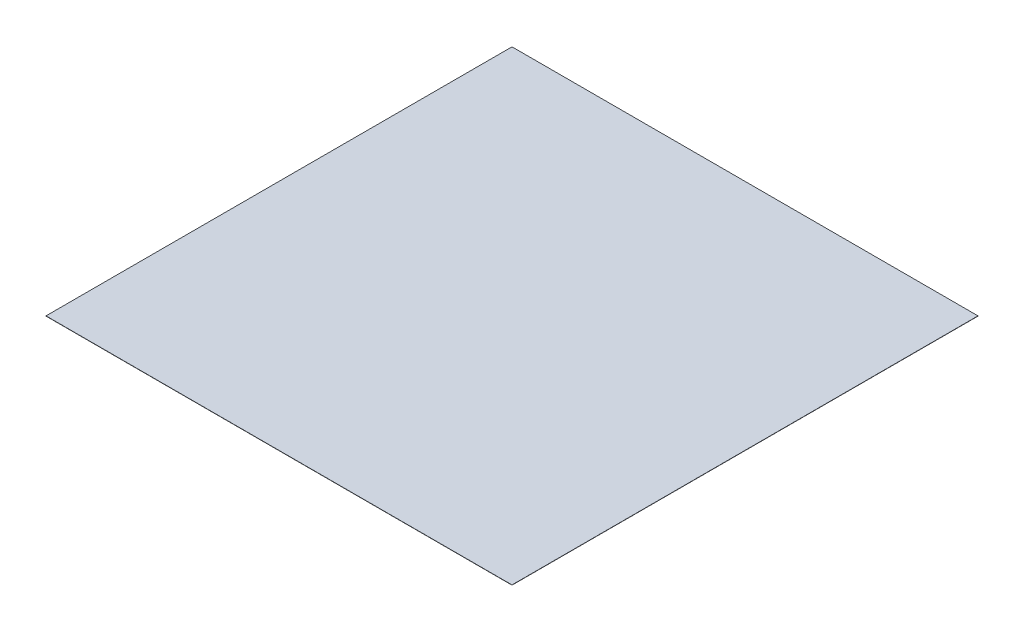
ISO-10303-21;
HEADER;
FILE_DESCRIPTION(('STEP AP214'),'2;1');
FILE_NAME('part.step','',(''),(''),'','','');
FILE_SCHEMA(('AUTOMOTIVE_DESIGN { 1 0 10303 214 1 1 1 1 }'));
ENDSEC;
DATA;
#1=APPLICATION_CONTEXT('core data for automotive mechanical design processes');
#2=APPLICATION_PROTOCOL_DEFINITION('international standard','automotive_design',2000,#1);
#3=PRODUCT_CONTEXT('',#1,'mechanical');
#4=PRODUCT('Part','Part','',(#3));
#5=PRODUCT_RELATED_PRODUCT_CATEGORY('part','',(#4));
#6=PRODUCT_DEFINITION_FORMATION('','',#4);
#7=PRODUCT_DEFINITION_CONTEXT('part definition',#1,'design');
#8=PRODUCT_DEFINITION('design','',#6,#7);
#9=PRODUCT_DEFINITION_SHAPE('','',#8);
#10=(LENGTH_UNIT() NAMED_UNIT(*) SI_UNIT(.MILLI.,.METRE.));
#11=(NAMED_UNIT(*) PLANE_ANGLE_UNIT() SI_UNIT($,.RADIAN.));
#12=(NAMED_UNIT(*) SI_UNIT($,.STERADIAN.) SOLID_ANGLE_UNIT());
#13=UNCERTAINTY_MEASURE_WITH_UNIT(LENGTH_MEASURE(1.E-05),#10,'distance_accuracy_value','');
#14=(GEOMETRIC_REPRESENTATION_CONTEXT(3) GLOBAL_UNCERTAINTY_ASSIGNED_CONTEXT((#13)) GLOBAL_UNIT_ASSIGNED_CONTEXT((#10,
#11,#12)) REPRESENTATION_CONTEXT('',''));
#15=CARTESIAN_POINT('',(0.,0.,0.));
#16=DIRECTION('',(0.,0.,1.));
#17=DIRECTION('',(1.,0.,0.));
#18=AXIS2_PLACEMENT_3D('',#15,#16,#17);
#19=CARTESIAN_POINT('',(5000.,5.,5000.));
#20=DIRECTION('',(-1.,0.,0.));
#21=DIRECTION('',(0.,0.,1.));
#22=AXIS2_PLACEMENT_3D('',#19,#20,#21);
#23=PLANE('',#22);
#24=DIRECTION('',(0.,0.,-1.));
#25=VECTOR('',#24,1.);
#26=CARTESIAN_POINT('',(5000.,0.,5000.));
#27=LINE('',#26,#25);
#28=CARTESIAN_POINT('',(5000.,0.,5000.));
#29=VERTEX_POINT('',#28);
#30=CARTESIAN_POINT('',(5000.,0.,-5000.));
#31=VERTEX_POINT('',#30);
#32=EDGE_CURVE('E111',#29,#31,#27,.T.);
#33=ORIENTED_EDGE('',*,*,#32,.T.);
#34=DIRECTION('',(0.,-1.,0.));
#35=VECTOR('',#34,1.);
#36=CARTESIAN_POINT('',(5000.,5.,-5000.));
#37=LINE('',#36,#35);
#38=CARTESIAN_POINT('',(5000.,5.,-5000.));
#39=VERTEX_POINT('',#38);
#40=EDGE_CURVE('E11',#39,#31,#37,.T.);
#41=ORIENTED_EDGE('',*,*,#40,.F.);
#42=DIRECTION('',(0.,0.,-1.));
#43=VECTOR('',#42,1.);
#44=CARTESIAN_POINT('',(5000.,5.,5000.));
#45=LINE('',#44,#43);
#46=CARTESIAN_POINT('',(5000.,5.,5000.));
#47=VERTEX_POINT('',#46);
#48=EDGE_CURVE('E95',#47,#39,#45,.T.);
#49=ORIENTED_EDGE('',*,*,#48,.F.);
#50=DIRECTION('',(0.,-1.,0.));
#51=VECTOR('',#50,1.);
#52=CARTESIAN_POINT('',(5000.,5.,5000.));
#53=LINE('',#52,#51);
#54=EDGE_CURVE('E107',#47,#29,#53,.T.);
#55=ORIENTED_EDGE('',*,*,#54,.T.);
#56=EDGE_LOOP('',(#33,#41,#49,#55));
#57=FACE_BOUND('',#56,.T.);
#58=ADVANCED_FACE('F43',(#57),#23,.F.);
#59=CARTESIAN_POINT('',(-5000.,5.,-5000.));
#60=DIRECTION('',(0.,0.,1.));
#61=DIRECTION('',(1.,0.,0.));
#62=AXIS2_PLACEMENT_3D('',#59,#60,#61);
#63=PLANE('',#62);
#64=DIRECTION('',(-1.,0.,0.));
#65=VECTOR('',#64,1.);
#66=CARTESIAN_POINT('',(-5000.,0.,-5000.));
#67=LINE('',#66,#65);
#68=CARTESIAN_POINT('',(-5000.,0.,-5000.));
#69=VERTEX_POINT('',#68);
#70=EDGE_CURVE('E100',#31,#69,#67,.T.);
#71=ORIENTED_EDGE('',*,*,#70,.T.);
#72=DIRECTION('',(0.,-1.,0.));
#73=VECTOR('',#72,1.);
#74=CARTESIAN_POINT('',(-5000.,5.,-5000.));
#75=LINE('',#74,#73);
#76=CARTESIAN_POINT('',(-5000.,5.,-5000.));
#77=VERTEX_POINT('',#76);
#78=EDGE_CURVE('E52',#77,#69,#75,.T.);
#79=ORIENTED_EDGE('',*,*,#78,.F.);
#80=DIRECTION('',(-1.,0.,0.));
#81=VECTOR('',#80,1.);
#82=CARTESIAN_POINT('',(-5000.,5.,-5000.));
#83=LINE('',#82,#81);
#84=EDGE_CURVE('E90',#39,#77,#83,.T.);
#85=ORIENTED_EDGE('',*,*,#84,.F.);
#86=ORIENTED_EDGE('',*,*,#40,.T.);
#87=EDGE_LOOP('',(#71,#79,#85,#86));
#88=FACE_BOUND('',#87,.T.);
#89=ADVANCED_FACE('F99',(#88),#63,.F.);
#90=CARTESIAN_POINT('',(-5000.,5.,5000.));
#91=DIRECTION('',(1.,0.,0.));
#92=DIRECTION('',(0.,0.,-1.));
#93=AXIS2_PLACEMENT_3D('',#90,#91,#92);
#94=PLANE('',#93);
#95=DIRECTION('',(0.,0.,1.));
#96=VECTOR('',#95,1.);
#97=CARTESIAN_POINT('',(-5000.,0.,5000.));
#98=LINE('',#97,#96);
#99=CARTESIAN_POINT('',(-5000.,0.,5000.));
#100=VERTEX_POINT('',#99);
#101=EDGE_CURVE('E77',#69,#100,#98,.T.);
#102=ORIENTED_EDGE('',*,*,#101,.T.);
#103=DIRECTION('',(0.,-1.,0.));
#104=VECTOR('',#103,1.);
#105=CARTESIAN_POINT('',(-5000.,5.,5000.));
#106=LINE('',#105,#104);
#107=CARTESIAN_POINT('',(-5000.,5.,5000.));
#108=VERTEX_POINT('',#107);
#109=EDGE_CURVE('E102',#108,#100,#106,.T.);
#110=ORIENTED_EDGE('',*,*,#109,.F.);
#111=DIRECTION('',(0.,0.,1.));
#112=VECTOR('',#111,1.);
#113=CARTESIAN_POINT('',(-5000.,5.,5000.));
#114=LINE('',#113,#112);
#115=EDGE_CURVE('E93',#77,#108,#114,.T.);
#116=ORIENTED_EDGE('',*,*,#115,.F.);
#117=ORIENTED_EDGE('',*,*,#78,.T.);
#118=EDGE_LOOP('',(#102,#110,#116,#117));
#119=FACE_BOUND('',#118,.T.);
#120=ADVANCED_FACE('F103',(#119),#94,.F.);
#121=CARTESIAN_POINT('',(-5000.,5.,5000.));
#122=DIRECTION('',(0.,0.,-1.));
#123=DIRECTION('',(-1.,0.,0.));
#124=AXIS2_PLACEMENT_3D('',#121,#122,#123);
#125=PLANE('',#124);
#126=DIRECTION('',(1.,0.,0.));
#127=VECTOR('',#126,1.);
#128=CARTESIAN_POINT('',(-5000.,0.,5000.));
#129=LINE('',#128,#127);
#130=EDGE_CURVE('E83',#100,#29,#129,.T.);
#131=ORIENTED_EDGE('',*,*,#130,.T.);
#132=ORIENTED_EDGE('',*,*,#54,.F.);
#133=DIRECTION('',(1.,0.,0.));
#134=VECTOR('',#133,1.);
#135=CARTESIAN_POINT('',(-5000.,5.,5000.));
#136=LINE('',#135,#134);
#137=EDGE_CURVE('E60',#108,#47,#136,.T.);
#138=ORIENTED_EDGE('',*,*,#137,.F.);
#139=ORIENTED_EDGE('',*,*,#109,.T.);
#140=EDGE_LOOP('',(#131,#132,#138,#139));
#141=FACE_BOUND('',#140,.T.);
#142=ADVANCED_FACE('F124',(#141),#125,.F.);
#143=CARTESIAN_POINT('',(0.,5.,0.));
#144=DIRECTION('',(0.,-1.,0.));
#145=DIRECTION('',(0.,0.,-1.));
#146=AXIS2_PLACEMENT_3D('',#143,#144,#145);
#147=PLANE('',#146);
#148=ORIENTED_EDGE('',*,*,#48,.T.);
#149=ORIENTED_EDGE('',*,*,#84,.T.);
#150=ORIENTED_EDGE('',*,*,#115,.T.);
#151=ORIENTED_EDGE('',*,*,#137,.T.);
#152=EDGE_LOOP('',(#148,#149,#150,#151));
#153=FACE_BOUND('',#152,.T.);
#154=ADVANCED_FACE('F91',(#153),#147,.F.);
#155=CARTESIAN_POINT('',(0.,0.,0.));
#156=DIRECTION('',(0.,-1.,0.));
#157=DIRECTION('',(0.,0.,-1.));
#158=AXIS2_PLACEMENT_3D('',#155,#156,#157);
#159=PLANE('',#158);
#160=ORIENTED_EDGE('',*,*,#32,.F.);
#161=ORIENTED_EDGE('',*,*,#130,.F.);
#162=ORIENTED_EDGE('',*,*,#101,.F.);
#163=ORIENTED_EDGE('',*,*,#70,.F.);
#164=EDGE_LOOP('',(#160,#161,#162,#163));
#165=FACE_BOUND('',#164,.T.);
#166=ADVANCED_FACE('F127',(#165),#159,.T.);
#167=CLOSED_SHELL('',(#58,#89,#120,#142,#154,#166));
#168=MANIFOLD_SOLID_BREP('B2',#167);
#169=ADVANCED_BREP_SHAPE_REPRESENTATION('',(#18,#168),#14);
#170=SHAPE_DEFINITION_REPRESENTATION(#9,#169);
ENDSEC;
END-ISO-10303-21;
